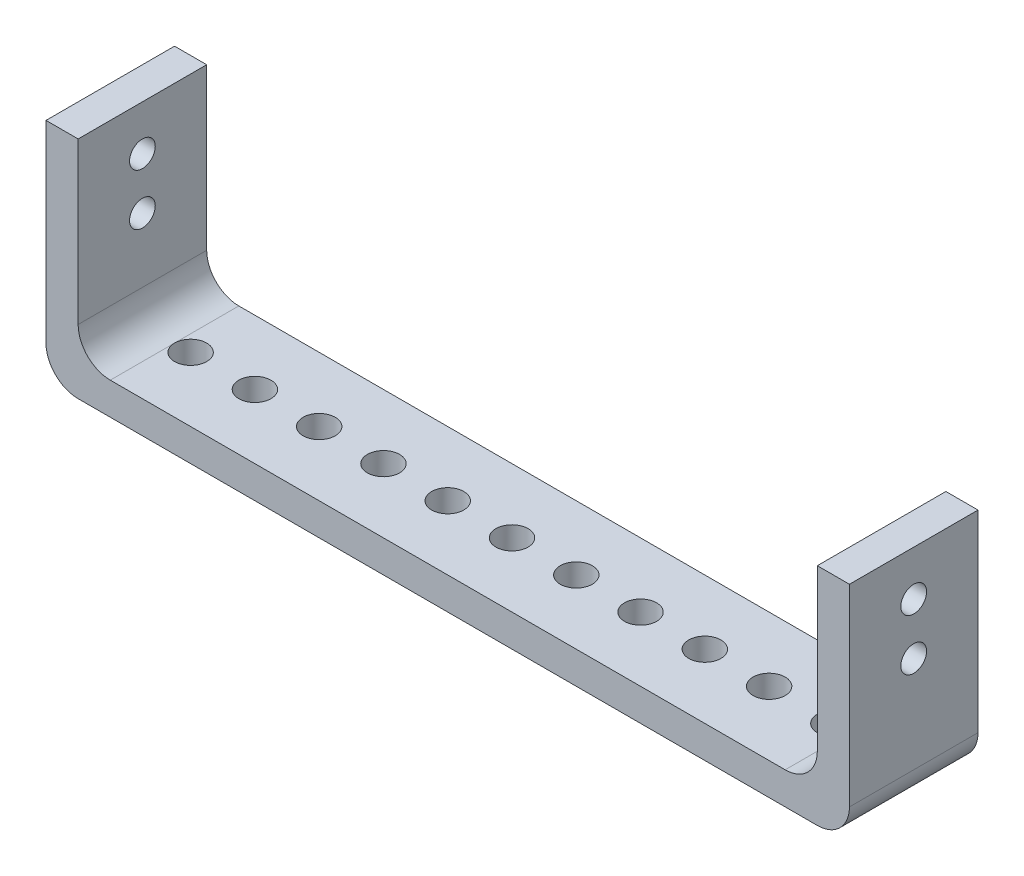
ISO-10303-21;
HEADER;
FILE_DESCRIPTION(('STEP AP214'),'2;1');
FILE_NAME('part.step','',(''),(''),'','','');
FILE_SCHEMA(('AUTOMOTIVE_DESIGN { 1 0 10303 214 1 1 1 1 }'));
ENDSEC;
DATA;
#1=APPLICATION_CONTEXT('core data for automotive mechanical design processes');
#2=APPLICATION_PROTOCOL_DEFINITION('international standard','automotive_design',2000,#1);
#3=PRODUCT_CONTEXT('',#1,'mechanical');
#4=PRODUCT('Part','Part','',(#3));
#5=PRODUCT_RELATED_PRODUCT_CATEGORY('part','',(#4));
#6=PRODUCT_DEFINITION_FORMATION('','',#4);
#7=PRODUCT_DEFINITION_CONTEXT('part definition',#1,'design');
#8=PRODUCT_DEFINITION('design','',#6,#7);
#9=PRODUCT_DEFINITION_SHAPE('','',#8);
#10=(LENGTH_UNIT() NAMED_UNIT(*) SI_UNIT(.MILLI.,.METRE.));
#11=(NAMED_UNIT(*) PLANE_ANGLE_UNIT() SI_UNIT($,.RADIAN.));
#12=(NAMED_UNIT(*) SI_UNIT($,.STERADIAN.) SOLID_ANGLE_UNIT());
#13=UNCERTAINTY_MEASURE_WITH_UNIT(LENGTH_MEASURE(1.E-05),#10,'distance_accuracy_value','');
#14=(GEOMETRIC_REPRESENTATION_CONTEXT(3) GLOBAL_UNCERTAINTY_ASSIGNED_CONTEXT((#13)) GLOBAL_UNIT_ASSIGNED_CONTEXT((#10,
#11,#12)) REPRESENTATION_CONTEXT('',''));
#15=CARTESIAN_POINT('',(0.,0.,0.));
#16=DIRECTION('',(0.,0.,1.));
#17=DIRECTION('',(1.,0.,0.));
#18=AXIS2_PLACEMENT_3D('',#15,#16,#17);
#19=CARTESIAN_POINT('',(-57.5,5.,10.));
#20=DIRECTION('',(0.,0.,-1.));
#21=DIRECTION('',(-1.,0.,0.));
#22=AXIS2_PLACEMENT_3D('',#19,#20,#21);
#23=CYLINDRICAL_SURFACE('',#22,4.99999999999999);
#24=CARTESIAN_POINT('',(-57.5,5.,-10.));
#25=DIRECTION('',(0.,0.,1.));
#26=DIRECTION('',(-1.,0.,0.));
#27=AXIS2_PLACEMENT_3D('',#24,#25,#26);
#28=CIRCLE('',#27,4.99999999999999);
#29=CARTESIAN_POINT('',(-62.5,5.,-10.));
#30=VERTEX_POINT('',#29);
#31=CARTESIAN_POINT('',(-57.5,0.,-10.));
#32=VERTEX_POINT('',#31);
#33=EDGE_CURVE('E152',#30,#32,#28,.T.);
#34=ORIENTED_EDGE('',*,*,#33,.T.);
#35=DIRECTION('',(0.,0.,-1.));
#36=VECTOR('',#35,1.);
#37=CARTESIAN_POINT('',(-57.5,0.,10.));
#38=LINE('',#37,#36);
#39=CARTESIAN_POINT('',(-57.5,0.,10.));
#40=VERTEX_POINT('',#39);
#41=EDGE_CURVE('E11',#40,#32,#38,.T.);
#42=ORIENTED_EDGE('',*,*,#41,.F.);
#43=CARTESIAN_POINT('',(-57.5,5.,10.));
#44=DIRECTION('',(0.,0.,1.));
#45=DIRECTION('',(-1.,0.,0.));
#46=AXIS2_PLACEMENT_3D('',#43,#44,#45);
#47=CIRCLE('',#46,4.99999999999999);
#48=CARTESIAN_POINT('',(-62.5,5.,10.));
#49=VERTEX_POINT('',#48);
#50=EDGE_CURVE('E140',#49,#40,#47,.T.);
#51=ORIENTED_EDGE('',*,*,#50,.F.);
#52=DIRECTION('',(0.,0.,-1.));
#53=VECTOR('',#52,1.);
#54=CARTESIAN_POINT('',(-62.5,5.,10.));
#55=LINE('',#54,#53);
#56=EDGE_CURVE('E153',#49,#30,#55,.T.);
#57=ORIENTED_EDGE('',*,*,#56,.T.);
#58=EDGE_LOOP('',(#34,#42,#51,#57));
#59=FACE_BOUND('',#58,.T.);
#60=ADVANCED_FACE('F39',(#59),#23,.T.);
#61=CARTESIAN_POINT('',(-57.5,0.,10.));
#62=DIRECTION('',(0.,1.,0.));
#63=DIRECTION('',(-1.,0.,0.));
#64=AXIS2_PLACEMENT_3D('',#61,#62,#63);
#65=PLANE('',#64);
#66=CARTESIAN_POINT('',(50.,0.,0.));
#67=DIRECTION('',(0.,1.,0.));
#68=DIRECTION('',(-1.,0.,0.));
#69=AXIS2_PLACEMENT_3D('',#66,#67,#68);
#70=CIRCLE('',#69,2.5);
#71=CARTESIAN_POINT('',(47.5,0.,0.));
#72=VERTEX_POINT('',#71);
#73=EDGE_CURVE('E264',#72,#72,#70,.T.);
#74=ORIENTED_EDGE('',*,*,#73,.T.);
#75=EDGE_LOOP('',(#74));
#76=FACE_BOUND('',#75,.T.);
#77=CARTESIAN_POINT('',(40.,0.,0.));
#78=DIRECTION('',(0.,1.,0.));
#79=DIRECTION('',(-1.,0.,0.));
#80=AXIS2_PLACEMENT_3D('',#77,#78,#79);
#81=CIRCLE('',#80,2.5);
#82=CARTESIAN_POINT('',(37.5,0.,0.));
#83=VERTEX_POINT('',#82);
#84=EDGE_CURVE('E252',#83,#83,#81,.T.);
#85=ORIENTED_EDGE('',*,*,#84,.T.);
#86=EDGE_LOOP('',(#85));
#87=FACE_BOUND('',#86,.T.);
#88=CARTESIAN_POINT('',(-10.,0.,0.));
#89=DIRECTION('',(0.,1.,0.));
#90=DIRECTION('',(-1.,0.,0.));
#91=AXIS2_PLACEMENT_3D('',#88,#89,#90);
#92=CIRCLE('',#91,2.5);
#93=CARTESIAN_POINT('',(-12.5,0.,0.));
#94=VERTEX_POINT('',#93);
#95=EDGE_CURVE('E249',#94,#94,#92,.T.);
#96=ORIENTED_EDGE('',*,*,#95,.T.);
#97=EDGE_LOOP('',(#96));
#98=FACE_BOUND('',#97,.T.);
#99=CARTESIAN_POINT('',(-20.,0.,-1.39659253553725E-13));
#100=DIRECTION('',(0.,1.,0.));
#101=DIRECTION('',(-1.,0.,0.));
#102=AXIS2_PLACEMENT_3D('',#99,#100,#101);
#103=CIRCLE('',#102,2.5);
#104=CARTESIAN_POINT('',(-22.5,0.,-1.39659253553725E-13));
#105=VERTEX_POINT('',#104);
#106=EDGE_CURVE('E246',#105,#105,#103,.T.);
#107=ORIENTED_EDGE('',*,*,#106,.T.);
#108=EDGE_LOOP('',(#107));
#109=FACE_BOUND('',#108,.T.);
#110=CARTESIAN_POINT('',(-30.,0.,-2.09488880330588E-13));
#111=DIRECTION('',(0.,1.,0.));
#112=DIRECTION('',(-1.,0.,0.));
#113=AXIS2_PLACEMENT_3D('',#110,#111,#112);
#114=CIRCLE('',#113,2.5);
#115=CARTESIAN_POINT('',(-32.5,0.,-2.09488880330588E-13));
#116=VERTEX_POINT('',#115);
#117=EDGE_CURVE('E242',#116,#116,#114,.T.);
#118=ORIENTED_EDGE('',*,*,#117,.T.);
#119=EDGE_LOOP('',(#118));
#120=FACE_BOUND('',#119,.T.);
#121=CARTESIAN_POINT('',(-40.,0.,-2.79318507107451E-13));
#122=DIRECTION('',(0.,1.,0.));
#123=DIRECTION('',(-1.,0.,0.));
#124=AXIS2_PLACEMENT_3D('',#121,#122,#123);
#125=CIRCLE('',#124,2.5);
#126=CARTESIAN_POINT('',(-42.5,0.,-2.79318507107451E-13));
#127=VERTEX_POINT('',#126);
#128=EDGE_CURVE('E238',#127,#127,#125,.T.);
#129=ORIENTED_EDGE('',*,*,#128,.T.);
#130=EDGE_LOOP('',(#129));
#131=FACE_BOUND('',#130,.T.);
#132=CARTESIAN_POINT('',(-50.,0.,-3.49148133884313E-13));
#133=DIRECTION('',(0.,1.,0.));
#134=DIRECTION('',(-1.,0.,0.));
#135=AXIS2_PLACEMENT_3D('',#132,#133,#134);
#136=CIRCLE('',#135,2.5);
#137=CARTESIAN_POINT('',(-52.5,0.,-3.49148133884313E-13));
#138=VERTEX_POINT('',#137);
#139=EDGE_CURVE('E222',#138,#138,#136,.T.);
#140=ORIENTED_EDGE('',*,*,#139,.T.);
#141=EDGE_LOOP('',(#140));
#142=FACE_BOUND('',#141,.T.);
#143=CARTESIAN_POINT('',(10.,0.,0.));
#144=DIRECTION('',(0.,1.,0.));
#145=DIRECTION('',(-1.,0.,0.));
#146=AXIS2_PLACEMENT_3D('',#143,#144,#145);
#147=CIRCLE('',#146,2.5);
#148=CARTESIAN_POINT('',(7.5,0.,0.));
#149=VERTEX_POINT('',#148);
#150=EDGE_CURVE('E234',#149,#149,#147,.T.);
#151=ORIENTED_EDGE('',*,*,#150,.T.);
#152=EDGE_LOOP('',(#151));
#153=FACE_BOUND('',#152,.T.);
#154=CARTESIAN_POINT('',(20.,0.,0.));
#155=DIRECTION('',(0.,1.,0.));
#156=DIRECTION('',(-1.,0.,0.));
#157=AXIS2_PLACEMENT_3D('',#154,#155,#156);
#158=CIRCLE('',#157,2.5);
#159=CARTESIAN_POINT('',(17.5,0.,0.));
#160=VERTEX_POINT('',#159);
#161=EDGE_CURVE('E230',#160,#160,#158,.T.);
#162=ORIENTED_EDGE('',*,*,#161,.T.);
#163=EDGE_LOOP('',(#162));
#164=FACE_BOUND('',#163,.T.);
#165=CARTESIAN_POINT('',(30.,0.,0.));
#166=DIRECTION('',(0.,1.,0.));
#167=DIRECTION('',(-1.,0.,0.));
#168=AXIS2_PLACEMENT_3D('',#165,#166,#167);
#169=CIRCLE('',#168,2.5);
#170=CARTESIAN_POINT('',(27.5,0.,0.));
#171=VERTEX_POINT('',#170);
#172=EDGE_CURVE('E226',#171,#171,#169,.T.);
#173=ORIENTED_EDGE('',*,*,#172,.T.);
#174=EDGE_LOOP('',(#173));
#175=FACE_BOUND('',#174,.T.);
#176=CARTESIAN_POINT('',(0.,0.,0.));
#177=DIRECTION('',(0.,1.,0.));
#178=DIRECTION('',(-1.,0.,0.));
#179=AXIS2_PLACEMENT_3D('',#176,#177,#178);
#180=CIRCLE('',#179,2.5);
#181=CARTESIAN_POINT('',(-2.5,0.,0.));
#182=VERTEX_POINT('',#181);
#183=EDGE_CURVE('E221',#182,#182,#180,.T.);
#184=ORIENTED_EDGE('',*,*,#183,.T.);
#185=EDGE_LOOP('',(#184));
#186=FACE_BOUND('',#185,.T.);
#187=DIRECTION('',(1.,0.,0.));
#188=VECTOR('',#187,1.);
#189=CARTESIAN_POINT('',(-57.5,0.,-10.));
#190=LINE('',#189,#188);
#191=CARTESIAN_POINT('',(57.5,0.,-10.));
#192=VERTEX_POINT('',#191);
#193=EDGE_CURVE('E156',#32,#192,#190,.T.);
#194=ORIENTED_EDGE('',*,*,#193,.T.);
#195=DIRECTION('',(0.,0.,-1.));
#196=VECTOR('',#195,1.);
#197=CARTESIAN_POINT('',(57.5,0.,10.));
#198=LINE('',#197,#196);
#199=CARTESIAN_POINT('',(57.5,0.,10.));
#200=VERTEX_POINT('',#199);
#201=EDGE_CURVE('E47',#200,#192,#198,.T.);
#202=ORIENTED_EDGE('',*,*,#201,.F.);
#203=DIRECTION('',(1.,0.,0.));
#204=VECTOR('',#203,1.);
#205=CARTESIAN_POINT('',(-57.5,0.,10.));
#206=LINE('',#205,#204);
#207=EDGE_CURVE('E131',#40,#200,#206,.T.);
#208=ORIENTED_EDGE('',*,*,#207,.F.);
#209=ORIENTED_EDGE('',*,*,#41,.T.);
#210=EDGE_LOOP('',(#194,#202,#208,#209));
#211=FACE_BOUND('',#210,.T.);
#212=ADVANCED_FACE('F133',(#76,#87,#98,#109,#120,#131,#142,#153,#164,#175,#186,#211),#65,.F.);
#213=CARTESIAN_POINT('',(57.5,5.,10.));
#214=DIRECTION('',(0.,0.,-1.));
#215=DIRECTION('',(-1.,0.,0.));
#216=AXIS2_PLACEMENT_3D('',#213,#214,#215);
#217=CYLINDRICAL_SURFACE('',#216,5.);
#218=CARTESIAN_POINT('',(57.5,5.,-10.));
#219=DIRECTION('',(0.,0.,1.));
#220=DIRECTION('',(1.,0.,0.));
#221=AXIS2_PLACEMENT_3D('',#218,#219,#220);
#222=CIRCLE('',#221,5.);
#223=CARTESIAN_POINT('',(62.5,5.,-10.));
#224=VERTEX_POINT('',#223);
#225=EDGE_CURVE('E159',#192,#224,#222,.T.);
#226=ORIENTED_EDGE('',*,*,#225,.T.);
#227=DIRECTION('',(0.,0.,-1.));
#228=VECTOR('',#227,1.);
#229=CARTESIAN_POINT('',(62.5,5.,10.));
#230=LINE('',#229,#228);
#231=CARTESIAN_POINT('',(62.5,5.,10.));
#232=VERTEX_POINT('',#231);
#233=EDGE_CURVE('E214',#232,#224,#230,.T.);
#234=ORIENTED_EDGE('',*,*,#233,.F.);
#235=CARTESIAN_POINT('',(57.5,5.,10.));
#236=DIRECTION('',(0.,0.,1.));
#237=DIRECTION('',(1.,0.,0.));
#238=AXIS2_PLACEMENT_3D('',#235,#236,#237);
#239=CIRCLE('',#238,5.);
#240=EDGE_CURVE('E139',#200,#232,#239,.T.);
#241=ORIENTED_EDGE('',*,*,#240,.F.);
#242=ORIENTED_EDGE('',*,*,#201,.T.);
#243=EDGE_LOOP('',(#226,#234,#241,#242));
#244=FACE_BOUND('',#243,.T.);
#245=ADVANCED_FACE('F349',(#244),#217,.T.);
#246=CARTESIAN_POINT('',(62.5,5.,10.));
#247=DIRECTION('',(-1.,0.,0.));
#248=DIRECTION('',(0.,-1.,0.));
#249=AXIS2_PLACEMENT_3D('',#246,#247,#248);
#250=PLANE('',#249);
#251=CARTESIAN_POINT('',(62.5,28.,0.));
#252=DIRECTION('',(-1.,0.,0.));
#253=DIRECTION('',(0.,-1.,0.));
#254=AXIS2_PLACEMENT_3D('',#251,#252,#253);
#255=CIRCLE('',#254,2.);
#256=CARTESIAN_POINT('',(62.5,26.,0.));
#257=VERTEX_POINT('',#256);
#258=EDGE_CURVE('E276',#257,#257,#255,.T.);
#259=ORIENTED_EDGE('',*,*,#258,.T.);
#260=EDGE_LOOP('',(#259));
#261=FACE_BOUND('',#260,.T.);
#262=CARTESIAN_POINT('',(62.5,20.,0.));
#263=DIRECTION('',(-1.,0.,0.));
#264=DIRECTION('',(0.,-1.,0.));
#265=AXIS2_PLACEMENT_3D('',#262,#263,#264);
#266=CIRCLE('',#265,2.);
#267=CARTESIAN_POINT('',(62.5,18.,0.));
#268=VERTEX_POINT('',#267);
#269=EDGE_CURVE('E157',#268,#268,#266,.T.);
#270=ORIENTED_EDGE('',*,*,#269,.T.);
#271=EDGE_LOOP('',(#270));
#272=FACE_BOUND('',#271,.T.);
#273=DIRECTION('',(0.,1.,0.));
#274=VECTOR('',#273,1.);
#275=CARTESIAN_POINT('',(62.5,5.,-10.));
#276=LINE('',#275,#274);
#277=CARTESIAN_POINT('',(62.5,35.,-10.));
#278=VERTEX_POINT('',#277);
#279=EDGE_CURVE('E168',#224,#278,#276,.T.);
#280=ORIENTED_EDGE('',*,*,#279,.T.);
#281=DIRECTION('',(0.,0.,-1.));
#282=VECTOR('',#281,1.);
#283=CARTESIAN_POINT('',(62.5,35.,10.));
#284=LINE('',#283,#282);
#285=CARTESIAN_POINT('',(62.5,35.,10.));
#286=VERTEX_POINT('',#285);
#287=EDGE_CURVE('E211',#286,#278,#284,.T.);
#288=ORIENTED_EDGE('',*,*,#287,.F.);
#289=DIRECTION('',(0.,1.,0.));
#290=VECTOR('',#289,1.);
#291=CARTESIAN_POINT('',(62.5,5.,10.));
#292=LINE('',#291,#290);
#293=EDGE_CURVE('E288',#232,#286,#292,.T.);
#294=ORIENTED_EDGE('',*,*,#293,.F.);
#295=ORIENTED_EDGE('',*,*,#233,.T.);
#296=EDGE_LOOP('',(#280,#288,#294,#295));
#297=FACE_BOUND('',#296,.T.);
#298=ADVANCED_FACE('F345',(#261,#272,#297),#250,.F.);
#299=CARTESIAN_POINT('',(62.5,35.,10.));
#300=DIRECTION('',(0.,-1.,0.));
#301=DIRECTION('',(0.,0.,-1.));
#302=AXIS2_PLACEMENT_3D('',#299,#300,#301);
#303=PLANE('',#302);
#304=DIRECTION('',(-1.,0.,0.));
#305=VECTOR('',#304,1.);
#306=CARTESIAN_POINT('',(62.5,35.,-10.));
#307=LINE('',#306,#305);
#308=CARTESIAN_POINT('',(57.5,35.,-10.));
#309=VERTEX_POINT('',#308);
#310=EDGE_CURVE('E170',#278,#309,#307,.T.);
#311=ORIENTED_EDGE('',*,*,#310,.T.);
#312=DIRECTION('',(0.,0.,-1.));
#313=VECTOR('',#312,1.);
#314=CARTESIAN_POINT('',(57.5,35.,10.));
#315=LINE('',#314,#313);
#316=CARTESIAN_POINT('',(57.5,35.,10.));
#317=VERTEX_POINT('',#316);
#318=EDGE_CURVE('E208',#317,#309,#315,.T.);
#319=ORIENTED_EDGE('',*,*,#318,.F.);
#320=DIRECTION('',(-1.,0.,0.));
#321=VECTOR('',#320,1.);
#322=CARTESIAN_POINT('',(62.5,35.,10.));
#323=LINE('',#322,#321);
#324=EDGE_CURVE('E290',#286,#317,#323,.T.);
#325=ORIENTED_EDGE('',*,*,#324,.F.);
#326=ORIENTED_EDGE('',*,*,#287,.T.);
#327=EDGE_LOOP('',(#311,#319,#325,#326));
#328=FACE_BOUND('',#327,.T.);
#329=ADVANCED_FACE('F340',(#328),#303,.F.);
#330=CARTESIAN_POINT('',(57.5,35.,10.));
#331=DIRECTION('',(1.,0.,0.));
#332=DIRECTION('',(0.,1.,0.));
#333=AXIS2_PLACEMENT_3D('',#330,#331,#332);
#334=PLANE('',#333);
#335=CARTESIAN_POINT('',(57.5,28.,0.));
#336=DIRECTION('',(1.,0.,0.));
#337=DIRECTION('',(0.,1.,0.));
#338=AXIS2_PLACEMENT_3D('',#335,#336,#337);
#339=CIRCLE('',#338,2.);
#340=CARTESIAN_POINT('',(57.5,30.,0.));
#341=VERTEX_POINT('',#340);
#342=EDGE_CURVE('E273',#341,#341,#339,.T.);
#343=ORIENTED_EDGE('',*,*,#342,.T.);
#344=EDGE_LOOP('',(#343));
#345=FACE_BOUND('',#344,.T.);
#346=CARTESIAN_POINT('',(57.5,20.,0.));
#347=DIRECTION('',(1.,0.,0.));
#348=DIRECTION('',(0.,1.,0.));
#349=AXIS2_PLACEMENT_3D('',#346,#347,#348);
#350=CIRCLE('',#349,2.);
#351=CARTESIAN_POINT('',(57.5,22.,0.));
#352=VERTEX_POINT('',#351);
#353=EDGE_CURVE('E162',#352,#352,#350,.T.);
#354=ORIENTED_EDGE('',*,*,#353,.T.);
#355=EDGE_LOOP('',(#354));
#356=FACE_BOUND('',#355,.T.);
#357=DIRECTION('',(0.,-1.,0.));
#358=VECTOR('',#357,1.);
#359=CARTESIAN_POINT('',(57.5,35.,-10.));
#360=LINE('',#359,#358);
#361=CARTESIAN_POINT('',(57.5,10.,-10.));
#362=VERTEX_POINT('',#361);
#363=EDGE_CURVE('E172',#309,#362,#360,.T.);
#364=ORIENTED_EDGE('',*,*,#363,.T.);
#365=DIRECTION('',(0.,0.,-1.));
#366=VECTOR('',#365,1.);
#367=CARTESIAN_POINT('',(57.5,10.,10.));
#368=LINE('',#367,#366);
#369=CARTESIAN_POINT('',(57.5,10.,10.));
#370=VERTEX_POINT('',#369);
#371=EDGE_CURVE('E205',#370,#362,#368,.T.);
#372=ORIENTED_EDGE('',*,*,#371,.F.);
#373=DIRECTION('',(0.,-1.,0.));
#374=VECTOR('',#373,1.);
#375=CARTESIAN_POINT('',(57.5,35.,10.));
#376=LINE('',#375,#374);
#377=EDGE_CURVE('E292',#317,#370,#376,.T.);
#378=ORIENTED_EDGE('',*,*,#377,.F.);
#379=ORIENTED_EDGE('',*,*,#318,.T.);
#380=EDGE_LOOP('',(#364,#372,#378,#379));
#381=FACE_BOUND('',#380,.T.);
#382=ADVANCED_FACE('F336',(#345,#356,#381),#334,.F.);
#383=CARTESIAN_POINT('',(52.5,10.,10.));
#384=DIRECTION('',(0.,0.,-1.));
#385=DIRECTION('',(-1.,0.,0.));
#386=AXIS2_PLACEMENT_3D('',#383,#384,#385);
#387=CYLINDRICAL_SURFACE('',#386,5.);
#388=CARTESIAN_POINT('',(52.5,10.,-10.));
#389=DIRECTION('',(0.,0.,-1.));
#390=DIRECTION('',(-1.,0.,0.));
#391=AXIS2_PLACEMENT_3D('',#388,#389,#390);
#392=CIRCLE('',#391,5.);
#393=CARTESIAN_POINT('',(52.5,5.,-10.));
#394=VERTEX_POINT('',#393);
#395=EDGE_CURVE('E174',#362,#394,#392,.T.);
#396=ORIENTED_EDGE('',*,*,#395,.T.);
#397=DIRECTION('',(0.,0.,-1.));
#398=VECTOR('',#397,1.);
#399=CARTESIAN_POINT('',(52.5,5.,10.));
#400=LINE('',#399,#398);
#401=CARTESIAN_POINT('',(52.5,5.,0.));
#402=VERTEX_POINT('',#401);
#403=EDGE_CURVE('E201',#402,#394,#400,.T.);
#404=ORIENTED_EDGE('',*,*,#403,.F.);
#405=CARTESIAN_POINT('',(52.5,5.,10.));
#406=VERTEX_POINT('',#405);
#407=EDGE_CURVE('E202',#406,#402,#400,.T.);
#408=ORIENTED_EDGE('',*,*,#407,.F.);
#409=CARTESIAN_POINT('',(52.5,10.,10.));
#410=DIRECTION('',(0.,0.,-1.));
#411=DIRECTION('',(-1.,0.,0.));
#412=AXIS2_PLACEMENT_3D('',#409,#410,#411);
#413=CIRCLE('',#412,5.);
#414=EDGE_CURVE('E294',#370,#406,#413,.T.);
#415=ORIENTED_EDGE('',*,*,#414,.F.);
#416=ORIENTED_EDGE('',*,*,#371,.T.);
#417=EDGE_LOOP('',(#396,#404,#408,#415,#416));
#418=FACE_BOUND('',#417,.T.);
#419=ADVANCED_FACE('F330',(#418),#387,.F.);
#420=CARTESIAN_POINT('',(52.5,5.,10.));
#421=DIRECTION('',(0.,-1.,0.));
#422=DIRECTION('',(1.,0.,0.));
#423=AXIS2_PLACEMENT_3D('',#420,#421,#422);
#424=PLANE('',#423);
#425=CARTESIAN_POINT('',(40.,5.,0.));
#426=DIRECTION('',(0.,-1.,0.));
#427=DIRECTION('',(1.,0.,0.));
#428=AXIS2_PLACEMENT_3D('',#425,#426,#427);
#429=CIRCLE('',#428,2.5);
#430=CARTESIAN_POINT('',(42.5,5.,0.));
#431=VERTEX_POINT('',#430);
#432=EDGE_CURVE('E250',#431,#431,#429,.T.);
#433=ORIENTED_EDGE('',*,*,#432,.T.);
#434=EDGE_LOOP('',(#433));
#435=FACE_BOUND('',#434,.T.);
#436=CARTESIAN_POINT('',(-10.,4.99999999999999,0.));
#437=DIRECTION('',(0.,-1.,0.));
#438=DIRECTION('',(1.,0.,0.));
#439=AXIS2_PLACEMENT_3D('',#436,#437,#438);
#440=CIRCLE('',#439,2.5);
#441=CARTESIAN_POINT('',(-7.5,4.99999999999999,0.));
#442=VERTEX_POINT('',#441);
#443=EDGE_CURVE('E247',#442,#442,#440,.T.);
#444=ORIENTED_EDGE('',*,*,#443,.T.);
#445=EDGE_LOOP('',(#444));
#446=FACE_BOUND('',#445,.T.);
#447=CARTESIAN_POINT('',(-20.,4.99999999999999,-1.39659253553725E-13));
#448=DIRECTION('',(0.,-1.,0.));
#449=DIRECTION('',(1.,0.,0.));
#450=AXIS2_PLACEMENT_3D('',#447,#448,#449);
#451=CIRCLE('',#450,2.5);
#452=CARTESIAN_POINT('',(-17.5,4.99999999999999,-1.39659253553725E-13));
#453=VERTEX_POINT('',#452);
#454=EDGE_CURVE('E243',#453,#453,#451,.T.);
#455=ORIENTED_EDGE('',*,*,#454,.T.);
#456=EDGE_LOOP('',(#455));
#457=FACE_BOUND('',#456,.T.);
#458=CARTESIAN_POINT('',(-30.,4.99999999999999,-2.09488880330588E-13));
#459=DIRECTION('',(0.,-1.,0.));
#460=DIRECTION('',(1.,0.,0.));
#461=AXIS2_PLACEMENT_3D('',#458,#459,#460);
#462=CIRCLE('',#461,2.5);
#463=CARTESIAN_POINT('',(-27.5,4.99999999999999,-2.09488880330588E-13));
#464=VERTEX_POINT('',#463);
#465=EDGE_CURVE('E239',#464,#464,#462,.T.);
#466=ORIENTED_EDGE('',*,*,#465,.T.);
#467=EDGE_LOOP('',(#466));
#468=FACE_BOUND('',#467,.T.);
#469=CARTESIAN_POINT('',(-40.,4.99999999999999,-2.79318507107451E-13));
#470=DIRECTION('',(0.,-1.,0.));
#471=DIRECTION('',(1.,0.,0.));
#472=AXIS2_PLACEMENT_3D('',#469,#470,#471);
#473=CIRCLE('',#472,2.5);
#474=CARTESIAN_POINT('',(-37.5,4.99999999999999,-2.79318507107451E-13));
#475=VERTEX_POINT('',#474);
#476=EDGE_CURVE('E235',#475,#475,#473,.T.);
#477=ORIENTED_EDGE('',*,*,#476,.T.);
#478=EDGE_LOOP('',(#477));
#479=FACE_BOUND('',#478,.T.);
#480=CARTESIAN_POINT('',(10.,4.99999999999999,0.));
#481=DIRECTION('',(0.,-1.,0.));
#482=DIRECTION('',(1.,0.,0.));
#483=AXIS2_PLACEMENT_3D('',#480,#481,#482);
#484=CIRCLE('',#483,2.5);
#485=CARTESIAN_POINT('',(12.5,4.99999999999999,0.));
#486=VERTEX_POINT('',#485);
#487=EDGE_CURVE('E231',#486,#486,#484,.T.);
#488=ORIENTED_EDGE('',*,*,#487,.T.);
#489=EDGE_LOOP('',(#488));
#490=FACE_BOUND('',#489,.T.);
#491=CARTESIAN_POINT('',(20.,5.,0.));
#492=DIRECTION('',(0.,-1.,0.));
#493=DIRECTION('',(1.,0.,0.));
#494=AXIS2_PLACEMENT_3D('',#491,#492,#493);
#495=CIRCLE('',#494,2.5);
#496=CARTESIAN_POINT('',(22.5,5.,0.));
#497=VERTEX_POINT('',#496);
#498=EDGE_CURVE('E227',#497,#497,#495,.T.);
#499=ORIENTED_EDGE('',*,*,#498,.T.);
#500=EDGE_LOOP('',(#499));
#501=FACE_BOUND('',#500,.T.);
#502=CARTESIAN_POINT('',(30.,5.,0.));
#503=DIRECTION('',(0.,-1.,0.));
#504=DIRECTION('',(1.,0.,0.));
#505=AXIS2_PLACEMENT_3D('',#502,#503,#504);
#506=CIRCLE('',#505,2.5);
#507=CARTESIAN_POINT('',(32.5,5.,0.));
#508=VERTEX_POINT('',#507);
#509=EDGE_CURVE('E223',#508,#508,#506,.T.);
#510=ORIENTED_EDGE('',*,*,#509,.T.);
#511=EDGE_LOOP('',(#510));
#512=FACE_BOUND('',#511,.T.);
#513=CARTESIAN_POINT('',(0.,4.99999999999999,0.));
#514=DIRECTION('',(0.,-1.,0.));
#515=DIRECTION('',(1.,0.,0.));
#516=AXIS2_PLACEMENT_3D('',#513,#514,#515);
#517=CIRCLE('',#516,2.5);
#518=CARTESIAN_POINT('',(2.5,4.99999999999999,0.));
#519=VERTEX_POINT('',#518);
#520=EDGE_CURVE('E218',#519,#519,#517,.T.);
#521=ORIENTED_EDGE('',*,*,#520,.T.);
#522=EDGE_LOOP('',(#521));
#523=FACE_BOUND('',#522,.T.);
#524=ORIENTED_EDGE('',*,*,#407,.T.);
#525=CARTESIAN_POINT('',(50.,5.,0.));
#526=DIRECTION('',(0.,-1.,0.));
#527=DIRECTION('',(1.,0.,0.));
#528=AXIS2_PLACEMENT_3D('',#525,#526,#527);
#529=CIRCLE('',#528,2.5);
#530=EDGE_CURVE('E42',#402,#402,#529,.T.);
#531=ORIENTED_EDGE('',*,*,#530,.T.);
#532=ORIENTED_EDGE('',*,*,#403,.T.);
#533=DIRECTION('',(-1.,0.,0.));
#534=VECTOR('',#533,1.);
#535=CARTESIAN_POINT('',(52.5,5.,-10.));
#536=LINE('',#535,#534);
#537=CARTESIAN_POINT('',(-52.5,4.99999999999999,-10.));
#538=VERTEX_POINT('',#537);
#539=EDGE_CURVE('E177',#394,#538,#536,.T.);
#540=ORIENTED_EDGE('',*,*,#539,.T.);
#541=DIRECTION('',(0.,0.,-1.));
#542=VECTOR('',#541,1.);
#543=CARTESIAN_POINT('',(-52.5,4.99999999999999,10.));
#544=LINE('',#543,#542);
#545=CARTESIAN_POINT('',(-52.5,4.99999999999999,-3.48679418671338E-13));
#546=VERTEX_POINT('',#545);
#547=EDGE_CURVE('E197',#546,#538,#544,.T.);
#548=ORIENTED_EDGE('',*,*,#547,.F.);
#549=CARTESIAN_POINT('',(-50.,4.99999999999999,-3.49148133884313E-13));
#550=DIRECTION('',(0.,-1.,0.));
#551=DIRECTION('',(1.,0.,0.));
#552=AXIS2_PLACEMENT_3D('',#549,#550,#551);
#553=CIRCLE('',#552,2.5);
#554=EDGE_CURVE('E57',#546,#546,#553,.T.);
#555=ORIENTED_EDGE('',*,*,#554,.T.);
#556=CARTESIAN_POINT('',(-52.5,4.99999999999999,10.));
#557=VERTEX_POINT('',#556);
#558=EDGE_CURVE('E198',#557,#546,#544,.T.);
#559=ORIENTED_EDGE('',*,*,#558,.F.);
#560=DIRECTION('',(-1.,0.,0.));
#561=VECTOR('',#560,1.);
#562=CARTESIAN_POINT('',(52.5,5.,10.));
#563=LINE('',#562,#561);
#564=EDGE_CURVE('E296',#406,#557,#563,.T.);
#565=ORIENTED_EDGE('',*,*,#564,.F.);
#566=EDGE_LOOP('',(#524,#531,#532,#540,#548,#555,#559,#565));
#567=FACE_BOUND('',#566,.T.);
#568=ADVANCED_FACE('F324',(#435,#446,#457,#468,#479,#490,#501,#512,#523,#567),#424,.F.);
#569=CARTESIAN_POINT('',(-52.5,9.99999999999999,10.));
#570=DIRECTION('',(0.,0.,-1.));
#571=DIRECTION('',(-1.,0.,0.));
#572=AXIS2_PLACEMENT_3D('',#569,#570,#571);
#573=CYLINDRICAL_SURFACE('',#572,5.);
#574=CARTESIAN_POINT('',(-52.5,9.99999999999999,-10.));
#575=DIRECTION('',(0.,0.,-1.));
#576=DIRECTION('',(-1.,0.,0.));
#577=AXIS2_PLACEMENT_3D('',#574,#575,#576);
#578=CIRCLE('',#577,5.);
#579=CARTESIAN_POINT('',(-57.5,9.99999999999999,-10.));
#580=VERTEX_POINT('',#579);
#581=EDGE_CURVE('E180',#538,#580,#578,.T.);
#582=ORIENTED_EDGE('',*,*,#581,.T.);
#583=DIRECTION('',(0.,0.,-1.));
#584=VECTOR('',#583,1.);
#585=CARTESIAN_POINT('',(-57.5,9.99999999999999,10.));
#586=LINE('',#585,#584);
#587=CARTESIAN_POINT('',(-57.5,9.99999999999999,10.));
#588=VERTEX_POINT('',#587);
#589=EDGE_CURVE('E194',#588,#580,#586,.T.);
#590=ORIENTED_EDGE('',*,*,#589,.F.);
#591=CARTESIAN_POINT('',(-52.5,9.99999999999999,10.));
#592=DIRECTION('',(0.,0.,-1.));
#593=DIRECTION('',(-1.,0.,0.));
#594=AXIS2_PLACEMENT_3D('',#591,#592,#593);
#595=CIRCLE('',#594,5.);
#596=EDGE_CURVE('E298',#557,#588,#595,.T.);
#597=ORIENTED_EDGE('',*,*,#596,.F.);
#598=ORIENTED_EDGE('',*,*,#558,.T.);
#599=ORIENTED_EDGE('',*,*,#547,.T.);
#600=EDGE_LOOP('',(#582,#590,#597,#598,#599));
#601=FACE_BOUND('',#600,.T.);
#602=ADVANCED_FACE('F320',(#601),#573,.F.);
#603=CARTESIAN_POINT('',(-57.5,9.99999999999999,10.));
#604=DIRECTION('',(-1.,0.,0.));
#605=DIRECTION('',(0.,0.,1.));
#606=AXIS2_PLACEMENT_3D('',#603,#604,#605);
#607=PLANE('',#606);
#608=CARTESIAN_POINT('',(-57.5,28.,0.));
#609=DIRECTION('',(-1.,0.,0.));
#610=DIRECTION('',(0.,0.,1.));
#611=AXIS2_PLACEMENT_3D('',#608,#609,#610);
#612=CIRCLE('',#611,2.);
#613=CARTESIAN_POINT('',(-57.5,28.,2.));
#614=VERTEX_POINT('',#613);
#615=EDGE_CURVE('E270',#614,#614,#612,.T.);
#616=ORIENTED_EDGE('',*,*,#615,.T.);
#617=EDGE_LOOP('',(#616));
#618=FACE_BOUND('',#617,.T.);
#619=CARTESIAN_POINT('',(-57.5,20.,0.));
#620=DIRECTION('',(-1.,0.,0.));
#621=DIRECTION('',(0.,0.,1.));
#622=AXIS2_PLACEMENT_3D('',#619,#620,#621);
#623=CIRCLE('',#622,2.);
#624=CARTESIAN_POINT('',(-57.5,20.,2.));
#625=VERTEX_POINT('',#624);
#626=EDGE_CURVE('E282',#625,#625,#623,.T.);
#627=ORIENTED_EDGE('',*,*,#626,.T.);
#628=EDGE_LOOP('',(#627));
#629=FACE_BOUND('',#628,.T.);
#630=DIRECTION('',(0.,1.,0.));
#631=VECTOR('',#630,1.);
#632=CARTESIAN_POINT('',(-57.5,9.99999999999999,-10.));
#633=LINE('',#632,#631);
#634=CARTESIAN_POINT('',(-57.5,35.,-10.));
#635=VERTEX_POINT('',#634);
#636=EDGE_CURVE('E182',#580,#635,#633,.T.);
#637=ORIENTED_EDGE('',*,*,#636,.T.);
#638=DIRECTION('',(0.,0.,-1.));
#639=VECTOR('',#638,1.);
#640=CARTESIAN_POINT('',(-57.5,35.,10.));
#641=LINE('',#640,#639);
#642=CARTESIAN_POINT('',(-57.5,35.,10.));
#643=VERTEX_POINT('',#642);
#644=EDGE_CURVE('E191',#643,#635,#641,.T.);
#645=ORIENTED_EDGE('',*,*,#644,.F.);
#646=DIRECTION('',(0.,1.,0.));
#647=VECTOR('',#646,1.);
#648=CARTESIAN_POINT('',(-57.5,9.99999999999999,10.));
#649=LINE('',#648,#647);
#650=EDGE_CURVE('E300',#588,#643,#649,.T.);
#651=ORIENTED_EDGE('',*,*,#650,.F.);
#652=ORIENTED_EDGE('',*,*,#589,.T.);
#653=EDGE_LOOP('',(#637,#645,#651,#652));
#654=FACE_BOUND('',#653,.T.);
#655=ADVANCED_FACE('F316',(#618,#629,#654),#607,.F.);
#656=CARTESIAN_POINT('',(-57.5,35.,10.));
#657=DIRECTION('',(0.,-1.,0.));
#658=DIRECTION('',(0.,0.,-1.));
#659=AXIS2_PLACEMENT_3D('',#656,#657,#658);
#660=PLANE('',#659);
#661=DIRECTION('',(-1.,0.,0.));
#662=VECTOR('',#661,1.);
#663=CARTESIAN_POINT('',(-57.5,35.,-10.));
#664=LINE('',#663,#662);
#665=CARTESIAN_POINT('',(-62.5,35.,-10.));
#666=VERTEX_POINT('',#665);
#667=EDGE_CURVE('E184',#635,#666,#664,.T.);
#668=ORIENTED_EDGE('',*,*,#667,.T.);
#669=DIRECTION('',(0.,0.,-1.));
#670=VECTOR('',#669,1.);
#671=CARTESIAN_POINT('',(-62.5,35.,10.));
#672=LINE('',#671,#670);
#673=CARTESIAN_POINT('',(-62.5,35.,10.));
#674=VERTEX_POINT('',#673);
#675=EDGE_CURVE('E188',#674,#666,#672,.T.);
#676=ORIENTED_EDGE('',*,*,#675,.F.);
#677=DIRECTION('',(-1.,0.,0.));
#678=VECTOR('',#677,1.);
#679=CARTESIAN_POINT('',(-57.5,35.,10.));
#680=LINE('',#679,#678);
#681=EDGE_CURVE('E301',#643,#674,#680,.T.);
#682=ORIENTED_EDGE('',*,*,#681,.F.);
#683=ORIENTED_EDGE('',*,*,#644,.T.);
#684=EDGE_LOOP('',(#668,#676,#682,#683));
#685=FACE_BOUND('',#684,.T.);
#686=ADVANCED_FACE('F307',(#685),#660,.F.);
#687=CARTESIAN_POINT('',(-62.5,35.,10.));
#688=DIRECTION('',(1.,0.,0.));
#689=DIRECTION('',(0.,1.,0.));
#690=AXIS2_PLACEMENT_3D('',#687,#688,#689);
#691=PLANE('',#690);
#692=CARTESIAN_POINT('',(-62.5,28.,0.));
#693=DIRECTION('',(1.,0.,0.));
#694=DIRECTION('',(0.,0.,-1.));
#695=AXIS2_PLACEMENT_3D('',#692,#693,#694);
#696=CIRCLE('',#695,2.);
#697=CARTESIAN_POINT('',(-62.5,28.,-2.));
#698=VERTEX_POINT('',#697);
#699=EDGE_CURVE('E267',#698,#698,#696,.T.);
#700=ORIENTED_EDGE('',*,*,#699,.T.);
#701=EDGE_LOOP('',(#700));
#702=FACE_BOUND('',#701,.T.);
#703=CARTESIAN_POINT('',(-62.5,20.,0.));
#704=DIRECTION('',(1.,0.,0.));
#705=DIRECTION('',(0.,0.,-1.));
#706=AXIS2_PLACEMENT_3D('',#703,#704,#705);
#707=CIRCLE('',#706,2.);
#708=CARTESIAN_POINT('',(-62.5,20.,-2.));
#709=VERTEX_POINT('',#708);
#710=EDGE_CURVE('E279',#709,#709,#707,.T.);
#711=ORIENTED_EDGE('',*,*,#710,.T.);
#712=EDGE_LOOP('',(#711));
#713=FACE_BOUND('',#712,.T.);
#714=DIRECTION('',(0.,-1.,0.));
#715=VECTOR('',#714,1.);
#716=CARTESIAN_POINT('',(-62.5,35.,-10.));
#717=LINE('',#716,#715);
#718=EDGE_CURVE('E149',#666,#30,#717,.T.);
#719=ORIENTED_EDGE('',*,*,#718,.T.);
#720=ORIENTED_EDGE('',*,*,#56,.F.);
#721=DIRECTION('',(0.,-1.,0.));
#722=VECTOR('',#721,1.);
#723=CARTESIAN_POINT('',(-62.5,35.,10.));
#724=LINE('',#723,#722);
#725=EDGE_CURVE('E145',#674,#49,#724,.T.);
#726=ORIENTED_EDGE('',*,*,#725,.F.);
#727=ORIENTED_EDGE('',*,*,#675,.T.);
#728=EDGE_LOOP('',(#719,#720,#726,#727));
#729=FACE_BOUND('',#728,.T.);
#730=ADVANCED_FACE('F310',(#702,#713,#729),#691,.F.);
#731=CARTESIAN_POINT('',(-57.5,5.,10.));
#732=DIRECTION('',(0.,0.,-1.));
#733=DIRECTION('',(-1.,0.,0.));
#734=AXIS2_PLACEMENT_3D('',#731,#732,#733);
#735=PLANE('',#734);
#736=ORIENTED_EDGE('',*,*,#50,.T.);
#737=ORIENTED_EDGE('',*,*,#207,.T.);
#738=ORIENTED_EDGE('',*,*,#240,.T.);
#739=ORIENTED_EDGE('',*,*,#293,.T.);
#740=ORIENTED_EDGE('',*,*,#324,.T.);
#741=ORIENTED_EDGE('',*,*,#377,.T.);
#742=ORIENTED_EDGE('',*,*,#414,.T.);
#743=ORIENTED_EDGE('',*,*,#564,.T.);
#744=ORIENTED_EDGE('',*,*,#596,.T.);
#745=ORIENTED_EDGE('',*,*,#650,.T.);
#746=ORIENTED_EDGE('',*,*,#681,.T.);
#747=ORIENTED_EDGE('',*,*,#725,.T.);
#748=EDGE_LOOP('',(#736,#737,#738,#739,#740,#741,#742,#743,#744,#745,#746,#747));
#749=FACE_BOUND('',#748,.T.);
#750=ADVANCED_FACE('F143',(#749),#735,.F.);
#751=CARTESIAN_POINT('',(-57.5,5.,-10.));
#752=DIRECTION('',(0.,0.,-1.));
#753=DIRECTION('',(-1.,0.,0.));
#754=AXIS2_PLACEMENT_3D('',#751,#752,#753);
#755=PLANE('',#754);
#756=ORIENTED_EDGE('',*,*,#33,.F.);
#757=ORIENTED_EDGE('',*,*,#718,.F.);
#758=ORIENTED_EDGE('',*,*,#667,.F.);
#759=ORIENTED_EDGE('',*,*,#636,.F.);
#760=ORIENTED_EDGE('',*,*,#581,.F.);
#761=ORIENTED_EDGE('',*,*,#539,.F.);
#762=ORIENTED_EDGE('',*,*,#395,.F.);
#763=ORIENTED_EDGE('',*,*,#363,.F.);
#764=ORIENTED_EDGE('',*,*,#310,.F.);
#765=ORIENTED_EDGE('',*,*,#279,.F.);
#766=ORIENTED_EDGE('',*,*,#225,.F.);
#767=ORIENTED_EDGE('',*,*,#193,.F.);
#768=EDGE_LOOP('',(#756,#757,#758,#759,#760,#761,#762,#763,#764,#765,#766,#767));
#769=FACE_BOUND('',#768,.T.);
#770=ADVANCED_FACE('F311',(#769),#755,.T.);
#771=CARTESIAN_POINT('',(-62.5,20.,0.));
#772=DIRECTION('',(1.,0.,0.));
#773=DIRECTION('',(0.,0.,-1.));
#774=AXIS2_PLACEMENT_3D('',#771,#772,#773);
#775=CYLINDRICAL_SURFACE('',#774,2.);
#776=ORIENTED_EDGE('',*,*,#710,.F.);
#777=EDGE_LOOP('',(#776));
#778=FACE_BOUND('',#777,.T.);
#779=ORIENTED_EDGE('',*,*,#626,.F.);
#780=EDGE_LOOP('',(#779));
#781=FACE_BOUND('',#780,.T.);
#782=ADVANCED_FACE('F422',(#778,#781),#775,.F.);
#783=ORIENTED_EDGE('',*,*,#353,.F.);
#784=EDGE_LOOP('',(#783));
#785=FACE_BOUND('',#784,.T.);
#786=ORIENTED_EDGE('',*,*,#269,.F.);
#787=EDGE_LOOP('',(#786));
#788=FACE_BOUND('',#787,.T.);
#789=ADVANCED_FACE('F425',(#785,#788),#775,.F.);
#790=CARTESIAN_POINT('',(-62.5,28.,0.));
#791=DIRECTION('',(1.,0.,0.));
#792=DIRECTION('',(0.,0.,-1.));
#793=AXIS2_PLACEMENT_3D('',#790,#791,#792);
#794=CYLINDRICAL_SURFACE('',#793,2.);
#795=ORIENTED_EDGE('',*,*,#699,.F.);
#796=EDGE_LOOP('',(#795));
#797=FACE_BOUND('',#796,.T.);
#798=ORIENTED_EDGE('',*,*,#615,.F.);
#799=EDGE_LOOP('',(#798));
#800=FACE_BOUND('',#799,.T.);
#801=ADVANCED_FACE('F428',(#797,#800),#794,.F.);
#802=ORIENTED_EDGE('',*,*,#342,.F.);
#803=EDGE_LOOP('',(#802));
#804=FACE_BOUND('',#803,.T.);
#805=ORIENTED_EDGE('',*,*,#258,.F.);
#806=EDGE_LOOP('',(#805));
#807=FACE_BOUND('',#806,.T.);
#808=ADVANCED_FACE('F430',(#804,#807),#794,.F.);
#809=CARTESIAN_POINT('',(0.,35.,0.));
#810=DIRECTION('',(0.,-1.,0.));
#811=DIRECTION('',(1.,0.,0.));
#812=AXIS2_PLACEMENT_3D('',#809,#810,#811);
#813=CYLINDRICAL_SURFACE('',#812,2.5);
#814=ORIENTED_EDGE('',*,*,#520,.F.);
#815=EDGE_LOOP('',(#814));
#816=FACE_BOUND('',#815,.T.);
#817=ORIENTED_EDGE('',*,*,#183,.F.);
#818=EDGE_LOOP('',(#817));
#819=FACE_BOUND('',#818,.T.);
#820=ADVANCED_FACE('F432',(#816,#819),#813,.F.);
#821=CARTESIAN_POINT('',(30.,35.,0.));
#822=DIRECTION('',(0.,-1.,0.));
#823=DIRECTION('',(1.,0.,0.));
#824=AXIS2_PLACEMENT_3D('',#821,#822,#823);
#825=CYLINDRICAL_SURFACE('',#824,2.5);
#826=ORIENTED_EDGE('',*,*,#509,.F.);
#827=EDGE_LOOP('',(#826));
#828=FACE_BOUND('',#827,.T.);
#829=ORIENTED_EDGE('',*,*,#172,.F.);
#830=EDGE_LOOP('',(#829));
#831=FACE_BOUND('',#830,.T.);
#832=ADVANCED_FACE('F436',(#828,#831),#825,.F.);
#833=CARTESIAN_POINT('',(20.,35.,0.));
#834=DIRECTION('',(0.,-1.,0.));
#835=DIRECTION('',(1.,0.,0.));
#836=AXIS2_PLACEMENT_3D('',#833,#834,#835);
#837=CYLINDRICAL_SURFACE('',#836,2.5);
#838=ORIENTED_EDGE('',*,*,#498,.F.);
#839=EDGE_LOOP('',(#838));
#840=FACE_BOUND('',#839,.T.);
#841=ORIENTED_EDGE('',*,*,#161,.F.);
#842=EDGE_LOOP('',(#841));
#843=FACE_BOUND('',#842,.T.);
#844=ADVANCED_FACE('F462',(#840,#843),#837,.F.);
#845=CARTESIAN_POINT('',(10.,35.,0.));
#846=DIRECTION('',(0.,-1.,0.));
#847=DIRECTION('',(1.,0.,0.));
#848=AXIS2_PLACEMENT_3D('',#845,#846,#847);
#849=CYLINDRICAL_SURFACE('',#848,2.5);
#850=ORIENTED_EDGE('',*,*,#487,.F.);
#851=EDGE_LOOP('',(#850));
#852=FACE_BOUND('',#851,.T.);
#853=ORIENTED_EDGE('',*,*,#150,.F.);
#854=EDGE_LOOP('',(#853));
#855=FACE_BOUND('',#854,.T.);
#856=ADVANCED_FACE('F466',(#852,#855),#849,.F.);
#857=CARTESIAN_POINT('',(-50.,35.,-3.49148133884313E-13));
#858=DIRECTION('',(0.,-1.,0.));
#859=DIRECTION('',(1.,0.,0.));
#860=AXIS2_PLACEMENT_3D('',#857,#858,#859);
#861=CYLINDRICAL_SURFACE('',#860,2.5);
#862=ORIENTED_EDGE('',*,*,#554,.F.);
#863=EDGE_LOOP('',(#862));
#864=FACE_BOUND('',#863,.T.);
#865=ORIENTED_EDGE('',*,*,#139,.F.);
#866=EDGE_LOOP('',(#865));
#867=FACE_BOUND('',#866,.T.);
#868=ADVANCED_FACE('F382',(#864,#867),#861,.F.);
#869=CARTESIAN_POINT('',(-40.,35.,-2.79318507107451E-13));
#870=DIRECTION('',(0.,-1.,0.));
#871=DIRECTION('',(1.,0.,0.));
#872=AXIS2_PLACEMENT_3D('',#869,#870,#871);
#873=CYLINDRICAL_SURFACE('',#872,2.5);
#874=ORIENTED_EDGE('',*,*,#476,.F.);
#875=EDGE_LOOP('',(#874));
#876=FACE_BOUND('',#875,.T.);
#877=ORIENTED_EDGE('',*,*,#128,.F.);
#878=EDGE_LOOP('',(#877));
#879=FACE_BOUND('',#878,.T.);
#880=ADVANCED_FACE('F372',(#876,#879),#873,.F.);
#881=CARTESIAN_POINT('',(-30.,35.,-2.09488880330588E-13));
#882=DIRECTION('',(0.,-1.,0.));
#883=DIRECTION('',(1.,0.,0.));
#884=AXIS2_PLACEMENT_3D('',#881,#882,#883);
#885=CYLINDRICAL_SURFACE('',#884,2.5);
#886=ORIENTED_EDGE('',*,*,#465,.F.);
#887=EDGE_LOOP('',(#886));
#888=FACE_BOUND('',#887,.T.);
#889=ORIENTED_EDGE('',*,*,#117,.F.);
#890=EDGE_LOOP('',(#889));
#891=FACE_BOUND('',#890,.T.);
#892=ADVANCED_FACE('F369',(#888,#891),#885,.F.);
#893=CARTESIAN_POINT('',(-20.,35.,-1.39659253553725E-13));
#894=DIRECTION('',(0.,-1.,0.));
#895=DIRECTION('',(1.,0.,0.));
#896=AXIS2_PLACEMENT_3D('',#893,#894,#895);
#897=CYLINDRICAL_SURFACE('',#896,2.5);
#898=ORIENTED_EDGE('',*,*,#454,.F.);
#899=EDGE_LOOP('',(#898));
#900=FACE_BOUND('',#899,.T.);
#901=ORIENTED_EDGE('',*,*,#106,.F.);
#902=EDGE_LOOP('',(#901));
#903=FACE_BOUND('',#902,.T.);
#904=ADVANCED_FACE('F371',(#900,#903),#897,.F.);
#905=CARTESIAN_POINT('',(-10.,35.,0.));
#906=DIRECTION('',(0.,-1.,0.));
#907=DIRECTION('',(1.,0.,0.));
#908=AXIS2_PLACEMENT_3D('',#905,#906,#907);
#909=CYLINDRICAL_SURFACE('',#908,2.5);
#910=ORIENTED_EDGE('',*,*,#443,.F.);
#911=EDGE_LOOP('',(#910));
#912=FACE_BOUND('',#911,.T.);
#913=ORIENTED_EDGE('',*,*,#95,.F.);
#914=EDGE_LOOP('',(#913));
#915=FACE_BOUND('',#914,.T.);
#916=ADVANCED_FACE('F379',(#912,#915),#909,.F.);
#917=CARTESIAN_POINT('',(40.,35.,0.));
#918=DIRECTION('',(0.,-1.,0.));
#919=DIRECTION('',(1.,0.,0.));
#920=AXIS2_PLACEMENT_3D('',#917,#918,#919);
#921=CYLINDRICAL_SURFACE('',#920,2.5);
#922=ORIENTED_EDGE('',*,*,#432,.F.);
#923=EDGE_LOOP('',(#922));
#924=FACE_BOUND('',#923,.T.);
#925=ORIENTED_EDGE('',*,*,#84,.F.);
#926=EDGE_LOOP('',(#925));
#927=FACE_BOUND('',#926,.T.);
#928=ADVANCED_FACE('F441',(#924,#927),#921,.F.);
#929=CARTESIAN_POINT('',(50.,35.,0.));
#930=DIRECTION('',(0.,-1.,0.));
#931=DIRECTION('',(1.,0.,0.));
#932=AXIS2_PLACEMENT_3D('',#929,#930,#931);
#933=CYLINDRICAL_SURFACE('',#932,2.5);
#934=ORIENTED_EDGE('',*,*,#530,.F.);
#935=EDGE_LOOP('',(#934));
#936=FACE_BOUND('',#935,.T.);
#937=ORIENTED_EDGE('',*,*,#73,.F.);
#938=EDGE_LOOP('',(#937));
#939=FACE_BOUND('',#938,.T.);
#940=ADVANCED_FACE('F438',(#936,#939),#933,.F.);
#941=CLOSED_SHELL('',(#60,#212,#245,#298,#329,#382,#419,#568,#602,#655,#686,#730,#750,#770,#782,
#789,#801,#808,#820,#832,#844,#856,#868,#880,#892,#904,#916,#928,#940));
#942=MANIFOLD_SOLID_BREP('B2',#941);
#943=ADVANCED_BREP_SHAPE_REPRESENTATION('',(#18,#942),#14);
#944=SHAPE_DEFINITION_REPRESENTATION(#9,#943);
ENDSEC;
END-ISO-10303-21;
